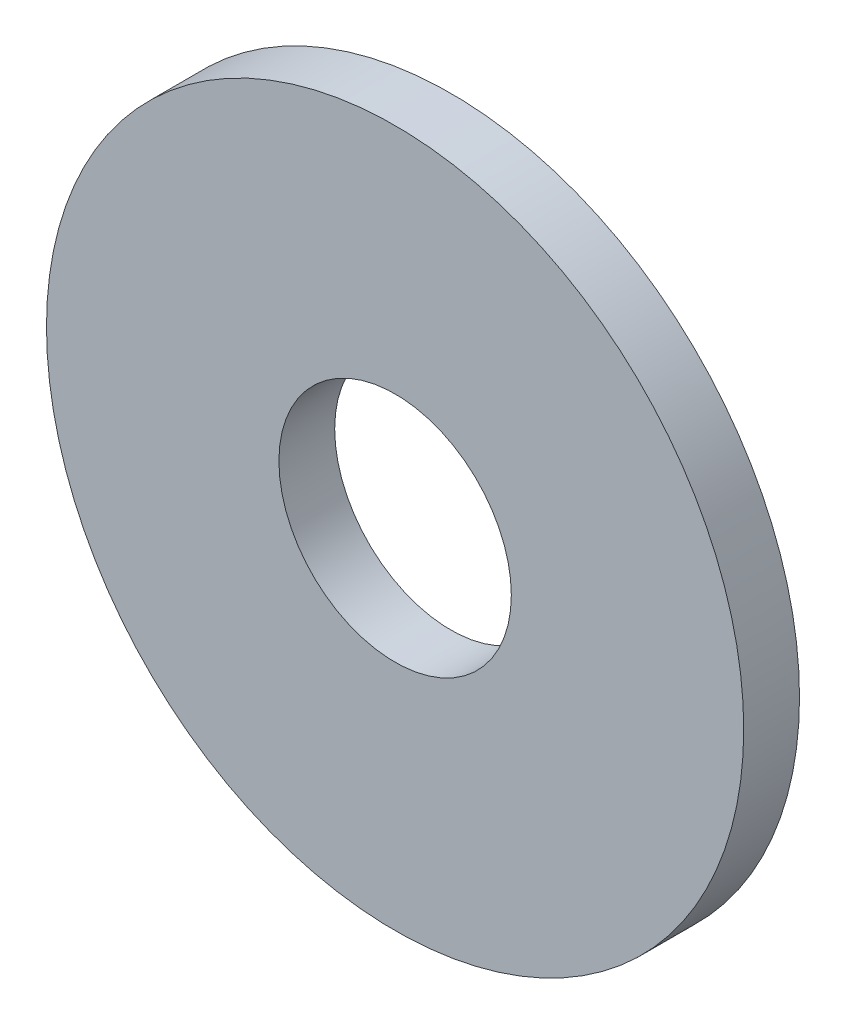
ISO-10303-21;
HEADER;
FILE_DESCRIPTION(('STEP AP214'),'2;1');
FILE_NAME('part.step','',(''),(''),'','','');
FILE_SCHEMA(('AUTOMOTIVE_DESIGN { 1 0 10303 214 1 1 1 1 }'));
ENDSEC;
DATA;
#1=APPLICATION_CONTEXT('core data for automotive mechanical design processes');
#2=APPLICATION_PROTOCOL_DEFINITION('international standard','automotive_design',2000,#1);
#3=PRODUCT_CONTEXT('',#1,'mechanical');
#4=PRODUCT('Part','Part','',(#3));
#5=PRODUCT_RELATED_PRODUCT_CATEGORY('part','',(#4));
#6=PRODUCT_DEFINITION_FORMATION('','',#4);
#7=PRODUCT_DEFINITION_CONTEXT('part definition',#1,'design');
#8=PRODUCT_DEFINITION('design','',#6,#7);
#9=PRODUCT_DEFINITION_SHAPE('','',#8);
#10=(LENGTH_UNIT() NAMED_UNIT(*) SI_UNIT(.MILLI.,.METRE.));
#11=(NAMED_UNIT(*) PLANE_ANGLE_UNIT() SI_UNIT($,.RADIAN.));
#12=(NAMED_UNIT(*) SI_UNIT($,.STERADIAN.) SOLID_ANGLE_UNIT());
#13=UNCERTAINTY_MEASURE_WITH_UNIT(LENGTH_MEASURE(1.E-05),#10,'distance_accuracy_value','');
#14=(GEOMETRIC_REPRESENTATION_CONTEXT(3) GLOBAL_UNCERTAINTY_ASSIGNED_CONTEXT((#13)) GLOBAL_UNIT_ASSIGNED_CONTEXT((#10,
#11,#12)) REPRESENTATION_CONTEXT('',''));
#15=CARTESIAN_POINT('',(0.,0.,0.));
#16=DIRECTION('',(0.,0.,1.));
#17=DIRECTION('',(1.,0.,0.));
#18=AXIS2_PLACEMENT_3D('',#15,#16,#17);
#19=CARTESIAN_POINT('',(0.,0.,1.2));
#20=DIRECTION('',(0.,0.,1.));
#21=DIRECTION('',(1.,0.,0.));
#22=AXIS2_PLACEMENT_3D('',#19,#20,#21);
#23=PLANE('',#22);
#24=CARTESIAN_POINT('',(0.,0.,1.2));
#25=DIRECTION('',(0.,0.,1.));
#26=DIRECTION('',(1.,0.,0.));
#27=AXIS2_PLACEMENT_3D('',#24,#25,#26);
#28=CIRCLE('',#27,7.5);
#29=CARTESIAN_POINT('',(7.5,0.,1.2));
#30=VERTEX_POINT('',#29);
#31=EDGE_CURVE('E10',#30,#30,#28,.T.);
#32=ORIENTED_EDGE('',*,*,#31,.T.);
#33=EDGE_LOOP('',(#32));
#34=FACE_BOUND('',#33,.T.);
#35=CARTESIAN_POINT('',(0.,0.,1.2));
#36=DIRECTION('',(0.,0.,1.));
#37=DIRECTION('',(1.,0.,0.));
#38=AXIS2_PLACEMENT_3D('',#35,#36,#37);
#39=CIRCLE('',#38,2.5);
#40=CARTESIAN_POINT('',(2.5,0.,1.2));
#41=VERTEX_POINT('',#40);
#42=EDGE_CURVE('E41',#41,#41,#39,.T.);
#43=ORIENTED_EDGE('',*,*,#42,.F.);
#44=EDGE_LOOP('',(#43));
#45=FACE_BOUND('',#44,.T.);
#46=ADVANCED_FACE('F30',(#34,#45),#23,.T.);
#47=CARTESIAN_POINT('',(0.,0.,0.));
#48=DIRECTION('',(0.,0.,1.));
#49=DIRECTION('',(1.,0.,0.));
#50=AXIS2_PLACEMENT_3D('',#47,#48,#49);
#51=PLANE('',#50);
#52=CARTESIAN_POINT('',(0.,0.,0.));
#53=DIRECTION('',(0.,0.,1.));
#54=DIRECTION('',(1.,0.,0.));
#55=AXIS2_PLACEMENT_3D('',#52,#53,#54);
#56=CIRCLE('',#55,7.5);
#57=CARTESIAN_POINT('',(7.5,0.,0.));
#58=VERTEX_POINT('',#57);
#59=EDGE_CURVE('E34',#58,#58,#56,.T.);
#60=ORIENTED_EDGE('',*,*,#59,.F.);
#61=EDGE_LOOP('',(#60));
#62=FACE_BOUND('',#61,.T.);
#63=CARTESIAN_POINT('',(0.,0.,0.));
#64=DIRECTION('',(0.,0.,1.));
#65=DIRECTION('',(1.,0.,0.));
#66=AXIS2_PLACEMENT_3D('',#63,#64,#65);
#67=CIRCLE('',#66,2.5);
#68=CARTESIAN_POINT('',(2.5,0.,0.));
#69=VERTEX_POINT('',#68);
#70=EDGE_CURVE('E43',#69,#69,#67,.T.);
#71=ORIENTED_EDGE('',*,*,#70,.T.);
#72=EDGE_LOOP('',(#71));
#73=FACE_BOUND('',#72,.T.);
#74=ADVANCED_FACE('F53',(#62,#73),#51,.F.);
#75=CARTESIAN_POINT('',(0.,0.,1.2));
#76=DIRECTION('',(0.,0.,-1.));
#77=DIRECTION('',(-1.,0.,0.));
#78=AXIS2_PLACEMENT_3D('',#75,#76,#77);
#79=CYLINDRICAL_SURFACE('',#78,7.5);
#80=ORIENTED_EDGE('',*,*,#31,.F.);
#81=EDGE_LOOP('',(#80));
#82=FACE_BOUND('',#81,.T.);
#83=ORIENTED_EDGE('',*,*,#59,.T.);
#84=EDGE_LOOP('',(#83));
#85=FACE_BOUND('',#84,.T.);
#86=ADVANCED_FACE('F32',(#82,#85),#79,.T.);
#87=CARTESIAN_POINT('',(0.,0.,1.2));
#88=DIRECTION('',(0.,0.,-1.));
#89=DIRECTION('',(-1.,0.,0.));
#90=AXIS2_PLACEMENT_3D('',#87,#88,#89);
#91=CYLINDRICAL_SURFACE('',#90,2.5);
#92=ORIENTED_EDGE('',*,*,#42,.T.);
#93=EDGE_LOOP('',(#92));
#94=FACE_BOUND('',#93,.T.);
#95=ORIENTED_EDGE('',*,*,#70,.F.);
#96=EDGE_LOOP('',(#95));
#97=FACE_BOUND('',#96,.T.);
#98=ADVANCED_FACE('F49',(#94,#97),#91,.F.);
#99=CLOSED_SHELL('',(#46,#74,#86,#98));
#100=MANIFOLD_SOLID_BREP('B2',#99);
#101=ADVANCED_BREP_SHAPE_REPRESENTATION('',(#18,#100),#14);
#102=SHAPE_DEFINITION_REPRESENTATION(#9,#101);
ENDSEC;
END-ISO-10303-21;
